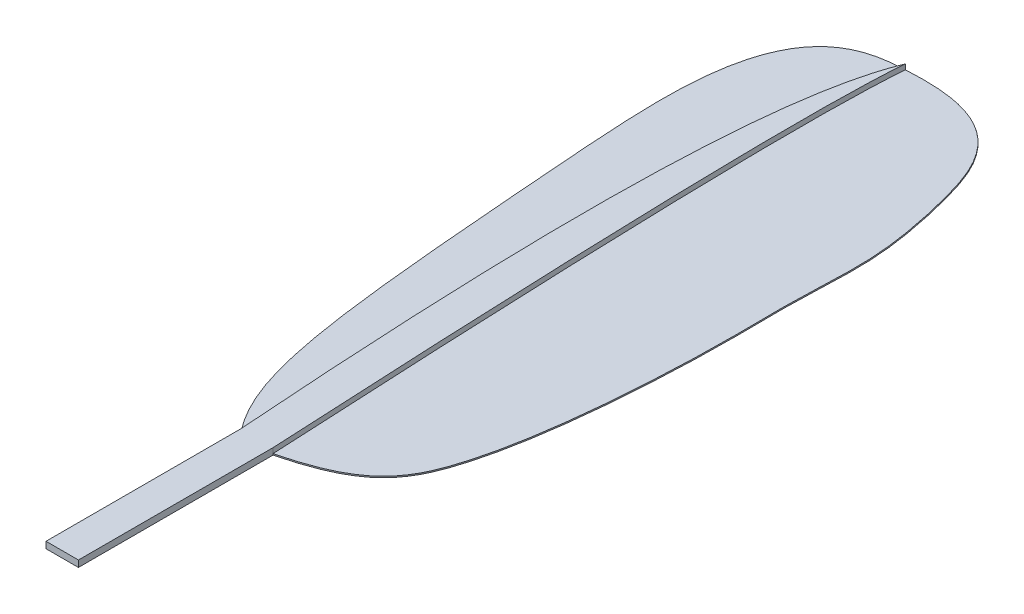
ISO-10303-21;
HEADER;
FILE_DESCRIPTION(('STEP AP214'),'2;1');
FILE_NAME('part.step','',(''),(''),'','','');
FILE_SCHEMA(('AUTOMOTIVE_DESIGN { 1 0 10303 214 1 1 1 1 }'));
ENDSEC;
DATA;
#1=APPLICATION_CONTEXT('core data for automotive mechanical design processes');
#2=APPLICATION_PROTOCOL_DEFINITION('international standard','automotive_design',2000,#1);
#3=PRODUCT_CONTEXT('',#1,'mechanical');
#4=PRODUCT('Part','Part','',(#3));
#5=PRODUCT_RELATED_PRODUCT_CATEGORY('part','',(#4));
#6=PRODUCT_DEFINITION_FORMATION('','',#4);
#7=PRODUCT_DEFINITION_CONTEXT('part definition',#1,'design');
#8=PRODUCT_DEFINITION('design','',#6,#7);
#9=PRODUCT_DEFINITION_SHAPE('','',#8);
#10=(LENGTH_UNIT() NAMED_UNIT(*) SI_UNIT(.MILLI.,.METRE.));
#11=(NAMED_UNIT(*) PLANE_ANGLE_UNIT() SI_UNIT($,.RADIAN.));
#12=(NAMED_UNIT(*) SI_UNIT($,.STERADIAN.) SOLID_ANGLE_UNIT());
#13=UNCERTAINTY_MEASURE_WITH_UNIT(LENGTH_MEASURE(1.E-05),#10,'distance_accuracy_value','');
#14=(GEOMETRIC_REPRESENTATION_CONTEXT(3) GLOBAL_UNCERTAINTY_ASSIGNED_CONTEXT((#13)) GLOBAL_UNIT_ASSIGNED_CONTEXT((#10,
#11,#12)) REPRESENTATION_CONTEXT('',''));
#15=CARTESIAN_POINT('',(0.,0.,0.));
#16=DIRECTION('',(0.,0.,1.));
#17=DIRECTION('',(1.,0.,0.));
#18=AXIS2_PLACEMENT_3D('',#15,#16,#17);
#19=CARTESIAN_POINT('',(-2.5,1.,0.));
#20=CARTESIAN_POINT('',(-8.33151031217227,1.,-79.885222780422));
#21=CARTESIAN_POINT('',(0.,1.,-100.));
#22=B_SPLINE_CURVE_WITH_KNOTS('',2,(#19,#20,#21),.UNSPECIFIED.,.F.,.F.,(3,3),(0.,1.),.UNSPECIFIED.);
#23=DIRECTION('',(0.,-1.,0.));
#24=VECTOR('',#23,1.);
#25=SURFACE_OF_LINEAR_EXTRUSION('',#22,#24);
#26=CARTESIAN_POINT('',(-2.5,0.2,0.));
#27=CARTESIAN_POINT('',(-8.33151031217227,0.2,-79.885222780422));
#28=CARTESIAN_POINT('',(0.,0.2,-100.));
#29=B_SPLINE_CURVE_WITH_KNOTS('',2,(#26,#27,#28),.UNSPECIFIED.,.F.,.F.,(3,3),(0.,1.),.UNSPECIFIED.);
#30=CARTESIAN_POINT('',(-2.5,0.2,0.));
#31=VERTEX_POINT('',#30);
#32=CARTESIAN_POINT('',(0.,0.2,-100.));
#33=VERTEX_POINT('',#32);
#34=EDGE_CURVE('E97',#31,#33,#29,.T.);
#35=ORIENTED_EDGE('',*,*,#34,.F.);
#36=DIRECTION('',(0.,-1.,0.));
#37=VECTOR('',#36,1.);
#38=CARTESIAN_POINT('',(-2.5,1.,0.));
#39=LINE('',#38,#37);
#40=CARTESIAN_POINT('',(-2.5,1.,0.));
#41=VERTEX_POINT('',#40);
#42=EDGE_CURVE('E12',#41,#31,#39,.T.);
#43=ORIENTED_EDGE('',*,*,#42,.F.);
#44=CARTESIAN_POINT('',(0.,1.,-100.));
#45=VERTEX_POINT('',#44);
#46=EDGE_CURVE('E263',#41,#45,#22,.T.);
#47=ORIENTED_EDGE('',*,*,#46,.T.);
#48=DIRECTION('',(0.,-1.,0.));
#49=VECTOR('',#48,1.);
#50=CARTESIAN_POINT('',(0.,1.,-100.));
#51=LINE('',#50,#49);
#52=EDGE_CURVE('E187',#45,#33,#51,.T.);
#53=ORIENTED_EDGE('',*,*,#52,.T.);
#54=EDGE_LOOP('',(#35,#43,#47,#53));
#55=FACE_BOUND('',#54,.T.);
#56=ADVANCED_FACE('F79',(#55),#25,.T.);
#57=CARTESIAN_POINT('',(-2.5,1.,0.));
#58=DIRECTION('',(1.,0.,0.));
#59=DIRECTION('',(0.,0.,-1.));
#60=AXIS2_PLACEMENT_3D('',#57,#58,#59);
#61=PLANE('',#60);
#62=DIRECTION('',(0.,0.,1.));
#63=VECTOR('',#62,1.);
#64=CARTESIAN_POINT('',(-2.5,0.,0.));
#65=LINE('',#64,#63);
#66=CARTESIAN_POINT('',(-2.5,0.,0.));
#67=VERTEX_POINT('',#66);
#68=CARTESIAN_POINT('',(-2.5,0.,30.));
#69=VERTEX_POINT('',#68);
#70=EDGE_CURVE('E156',#67,#69,#65,.T.);
#71=ORIENTED_EDGE('',*,*,#70,.T.);
#72=DIRECTION('',(0.,-1.,0.));
#73=VECTOR('',#72,1.);
#74=CARTESIAN_POINT('',(-2.5,1.,30.));
#75=LINE('',#74,#73);
#76=CARTESIAN_POINT('',(-2.5,1.,30.));
#77=VERTEX_POINT('',#76);
#78=EDGE_CURVE('E89',#77,#69,#75,.T.);
#79=ORIENTED_EDGE('',*,*,#78,.F.);
#80=DIRECTION('',(0.,0.,1.));
#81=VECTOR('',#80,1.);
#82=CARTESIAN_POINT('',(-2.5,1.,0.));
#83=LINE('',#82,#81);
#84=EDGE_CURVE('E266',#41,#77,#83,.T.);
#85=ORIENTED_EDGE('',*,*,#84,.F.);
#86=ORIENTED_EDGE('',*,*,#42,.T.);
#87=DIRECTION('',(0.,-1.,0.));
#88=VECTOR('',#87,1.);
#89=CARTESIAN_POINT('',(-2.5,0.2,0.));
#90=LINE('',#89,#88);
#91=EDGE_CURVE('E160',#31,#67,#90,.T.);
#92=ORIENTED_EDGE('',*,*,#91,.T.);
#93=EDGE_LOOP('',(#71,#79,#85,#86,#92));
#94=FACE_BOUND('',#93,.T.);
#95=ADVANCED_FACE('F281',(#94),#61,.F.);
#96=CARTESIAN_POINT('',(0.,1.,30.));
#97=DIRECTION('',(0.,0.,-1.));
#98=DIRECTION('',(-1.,0.,0.));
#99=AXIS2_PLACEMENT_3D('',#96,#97,#98);
#100=PLANE('',#99);
#101=DIRECTION('',(1.,0.,0.));
#102=VECTOR('',#101,1.);
#103=CARTESIAN_POINT('',(0.,0.,30.));
#104=LINE('',#103,#102);
#105=CARTESIAN_POINT('',(2.5,0.,30.));
#106=VERTEX_POINT('',#105);
#107=EDGE_CURVE('E259',#69,#106,#104,.T.);
#108=ORIENTED_EDGE('',*,*,#107,.T.);
#109=DIRECTION('',(0.,-1.,0.));
#110=VECTOR('',#109,1.);
#111=CARTESIAN_POINT('',(2.5,1.,30.));
#112=LINE('',#111,#110);
#113=CARTESIAN_POINT('',(2.5,1.,30.));
#114=VERTEX_POINT('',#113);
#115=EDGE_CURVE('E199',#114,#106,#112,.T.);
#116=ORIENTED_EDGE('',*,*,#115,.F.);
#117=DIRECTION('',(1.,0.,0.));
#118=VECTOR('',#117,1.);
#119=CARTESIAN_POINT('',(0.,1.,30.));
#120=LINE('',#119,#118);
#121=EDGE_CURVE('E269',#77,#114,#120,.T.);
#122=ORIENTED_EDGE('',*,*,#121,.F.);
#123=ORIENTED_EDGE('',*,*,#78,.T.);
#124=EDGE_LOOP('',(#108,#116,#122,#123));
#125=FACE_BOUND('',#124,.T.);
#126=ADVANCED_FACE('F285',(#125),#100,.F.);
#127=CARTESIAN_POINT('',(2.5,1.,0.));
#128=DIRECTION('',(1.,0.,0.));
#129=DIRECTION('',(0.,0.,-1.));
#130=AXIS2_PLACEMENT_3D('',#127,#128,#129);
#131=PLANE('',#130);
#132=DIRECTION('',(0.,0.,1.));
#133=VECTOR('',#132,1.);
#134=CARTESIAN_POINT('',(2.5,0.,0.));
#135=LINE('',#134,#133);
#136=CARTESIAN_POINT('',(2.5,0.,0.));
#137=VERTEX_POINT('',#136);
#138=EDGE_CURVE('E196',#137,#106,#135,.T.);
#139=ORIENTED_EDGE('',*,*,#138,.F.);
#140=DIRECTION('',(0.,-1.,0.));
#141=VECTOR('',#140,1.);
#142=CARTESIAN_POINT('',(2.5,0.2,0.));
#143=LINE('',#142,#141);
#144=CARTESIAN_POINT('',(2.5,0.2,0.));
#145=VERTEX_POINT('',#144);
#146=EDGE_CURVE('E104',#145,#137,#143,.T.);
#147=ORIENTED_EDGE('',*,*,#146,.F.);
#148=DIRECTION('',(0.,-1.,0.));
#149=VECTOR('',#148,1.);
#150=CARTESIAN_POINT('',(2.5,1.,0.));
#151=LINE('',#150,#149);
#152=CARTESIAN_POINT('',(2.5,1.,0.));
#153=VERTEX_POINT('',#152);
#154=EDGE_CURVE('E191',#153,#145,#151,.T.);
#155=ORIENTED_EDGE('',*,*,#154,.F.);
#156=DIRECTION('',(0.,0.,1.));
#157=VECTOR('',#156,1.);
#158=CARTESIAN_POINT('',(2.5,1.,0.));
#159=LINE('',#158,#157);
#160=EDGE_CURVE('E253',#153,#114,#159,.T.);
#161=ORIENTED_EDGE('',*,*,#160,.T.);
#162=ORIENTED_EDGE('',*,*,#115,.T.);
#163=EDGE_LOOP('',(#139,#147,#155,#161,#162));
#164=FACE_BOUND('',#163,.T.);
#165=ADVANCED_FACE('F245',(#164),#131,.T.);
#166=CARTESIAN_POINT('',(2.5,1.,0.));
#167=CARTESIAN_POINT('',(-1.63918434809833,1.,-79.8301801534041));
#168=CARTESIAN_POINT('',(0.,1.,-100.));
#169=B_SPLINE_CURVE_WITH_KNOTS('',2,(#166,#167,#168),.UNSPECIFIED.,.F.,.F.,(3,3),(0.,1.),.UNSPECIFIED.);
#170=DIRECTION('',(0.,-1.,0.));
#171=VECTOR('',#170,1.);
#172=SURFACE_OF_LINEAR_EXTRUSION('',#169,#171);
#173=ORIENTED_EDGE('',*,*,#154,.T.);
#174=CARTESIAN_POINT('',(2.5,0.2,0.));
#175=CARTESIAN_POINT('',(-1.63918434809833,0.2,-79.8301801534041));
#176=CARTESIAN_POINT('',(0.,0.2,-100.));
#177=B_SPLINE_CURVE_WITH_KNOTS('',2,(#174,#175,#176),.UNSPECIFIED.,.F.,.F.,(3,3),(0.,1.),.UNSPECIFIED.);
#178=EDGE_CURVE('E148',#145,#33,#177,.T.);
#179=ORIENTED_EDGE('',*,*,#178,.T.);
#180=ORIENTED_EDGE('',*,*,#52,.F.);
#181=EDGE_CURVE('E192',#153,#45,#169,.T.);
#182=ORIENTED_EDGE('',*,*,#181,.F.);
#183=EDGE_LOOP('',(#173,#179,#180,#182));
#184=FACE_BOUND('',#183,.T.);
#185=ADVANCED_FACE('F209',(#184),#172,.F.);
#186=CARTESIAN_POINT('',(0.,1.,0.));
#187=DIRECTION('',(0.,1.,0.));
#188=DIRECTION('',(0.,0.,1.));
#189=AXIS2_PLACEMENT_3D('',#186,#187,#188);
#190=PLANE('',#189);
#191=ORIENTED_EDGE('',*,*,#46,.F.);
#192=ORIENTED_EDGE('',*,*,#84,.T.);
#193=ORIENTED_EDGE('',*,*,#121,.T.);
#194=ORIENTED_EDGE('',*,*,#160,.F.);
#195=ORIENTED_EDGE('',*,*,#181,.T.);
#196=EDGE_LOOP('',(#191,#192,#193,#194,#195));
#197=FACE_BOUND('',#196,.T.);
#198=ADVANCED_FACE('F236',(#197),#190,.T.);
#199=CARTESIAN_POINT('',(0.,0.,0.));
#200=DIRECTION('',(0.,1.,0.));
#201=DIRECTION('',(0.,0.,1.));
#202=AXIS2_PLACEMENT_3D('',#199,#200,#201);
#203=PLANE('',#202);
#204=ORIENTED_EDGE('',*,*,#70,.F.);
#205=CARTESIAN_POINT('',(0.,0.,-100.));
#206=CARTESIAN_POINT('',(-7.35753604473764,0.,-99.756200735484));
#207=CARTESIAN_POINT('',(-16.6393614546275,0.,-96.1727396098631));
#208=CARTESIAN_POINT('',(-11.3376545029552,0.,-24.2277312876407));
#209=CARTESIAN_POINT('',(-9.55772822347636,0.,-8.38325722956601));
#210=CARTESIAN_POINT('',(-2.49999999999996,0.,0.));
#211=B_SPLINE_CURVE_WITH_KNOTS('',3,(#205,#206,#207,#208,#209,#210),.UNSPECIFIED.,.F.,.F.,(4,1,
1,4),(0.,0.313531983306057,0.413531983306057,1.),.UNSPECIFIED.);
#212=CARTESIAN_POINT('',(0.,0.,-100.));
#213=VERTEX_POINT('',#212);
#214=EDGE_CURVE('E153',#213,#67,#211,.T.);
#215=ORIENTED_EDGE('',*,*,#214,.F.);
#216=CARTESIAN_POINT('',(2.5,0.,0.));
#217=CARTESIAN_POINT('',(12.9342013073396,0.,-2.63107768561277));
#218=CARTESIAN_POINT('',(20.6224835825794,0.,-11.7076151659828));
#219=CARTESIAN_POINT('',(22.5547360806352,0.,-44.5430397404868));
#220=CARTESIAN_POINT('',(22.0049059992091,0.,-67.1717850112475));
#221=CARTESIAN_POINT('',(23.8109051463702,0.,-72.5917666718817));
#222=CARTESIAN_POINT('',(16.9191397590032,0.,-98.0712072019772));
#223=CARTESIAN_POINT('',(8.94241288910098,0.,-100.567138422392));
#224=CARTESIAN_POINT('',(0.,0.,-100.));
#225=B_SPLINE_CURVE_WITH_KNOTS('',3,(#216,#217,#218,#219,#220,#221,#222,#223,#224),
.UNSPECIFIED.,.F.,.F.,(4,1,1,1,1,1,4),(0.,0.156099619785498,0.394681350415879,0.460940872053778,
0.75243531452659,0.809984907852122,1.),.UNSPECIFIED.);
#226=EDGE_CURVE('E138',#137,#213,#225,.T.);
#227=ORIENTED_EDGE('',*,*,#226,.F.);
#228=ORIENTED_EDGE('',*,*,#138,.T.);
#229=ORIENTED_EDGE('',*,*,#107,.F.);
#230=EDGE_LOOP('',(#204,#215,#227,#228,#229));
#231=FACE_BOUND('',#230,.T.);
#232=ADVANCED_FACE('F154',(#231),#203,.F.);
#233=CARTESIAN_POINT('',(2.5,0.2,0.));
#234=CARTESIAN_POINT('',(12.9342013073396,0.2,-2.63107768561277));
#235=CARTESIAN_POINT('',(20.6224835825794,0.2,-11.7076151659828));
#236=CARTESIAN_POINT('',(22.5547360806352,0.2,-44.5430397404868));
#237=CARTESIAN_POINT('',(22.0049059992091,0.2,-67.1717850112475));
#238=CARTESIAN_POINT('',(23.8109051463702,0.2,-72.5917666718817));
#239=CARTESIAN_POINT('',(16.9191397590032,0.2,-98.0712072019772));
#240=CARTESIAN_POINT('',(8.94241288910098,0.2,-100.567138422392));
#241=CARTESIAN_POINT('',(0.,0.2,-100.));
#242=B_SPLINE_CURVE_WITH_KNOTS('',3,(#233,#234,#235,#236,#237,#238,#239,#240,#241),
.UNSPECIFIED.,.F.,.F.,(4,1,1,1,1,1,4),(0.,0.156099619785498,0.394681350415879,0.460940872053778,
0.75243531452659,0.809984907852122,1.),.UNSPECIFIED.);
#243=DIRECTION('',(0.,-1.,0.));
#244=VECTOR('',#243,1.);
#245=SURFACE_OF_LINEAR_EXTRUSION('',#242,#244);
#246=ORIENTED_EDGE('',*,*,#226,.T.);
#247=DIRECTION('',(0.,-1.,0.));
#248=VECTOR('',#247,1.);
#249=CARTESIAN_POINT('',(0.,0.2,-100.));
#250=LINE('',#249,#248);
#251=EDGE_CURVE('E143',#33,#213,#250,.T.);
#252=ORIENTED_EDGE('',*,*,#251,.F.);
#253=EDGE_CURVE('E165',#145,#33,#242,.T.);
#254=ORIENTED_EDGE('',*,*,#253,.F.);
#255=ORIENTED_EDGE('',*,*,#146,.T.);
#256=EDGE_LOOP('',(#246,#252,#254,#255));
#257=FACE_BOUND('',#256,.T.);
#258=ADVANCED_FACE('F140',(#257),#245,.F.);
#259=CARTESIAN_POINT('',(0.,0.2,0.));
#260=DIRECTION('',(0.,1.,0.));
#261=DIRECTION('',(0.,0.,1.));
#262=AXIS2_PLACEMENT_3D('',#259,#260,#261);
#263=PLANE('',#262);
#264=ORIENTED_EDGE('',*,*,#178,.F.);
#265=ORIENTED_EDGE('',*,*,#253,.T.);
#266=EDGE_LOOP('',(#264,#265));
#267=FACE_BOUND('',#266,.T.);
#268=ADVANCED_FACE('F214',(#267),#263,.T.);
#269=CARTESIAN_POINT('',(0.,0.2,-100.));
#270=CARTESIAN_POINT('',(-7.35753604473764,0.2,-99.756200735484));
#271=CARTESIAN_POINT('',(-16.6393614546275,0.2,-96.1727396098631));
#272=CARTESIAN_POINT('',(-11.3376545029552,0.2,-24.2277312876407));
#273=CARTESIAN_POINT('',(-9.55772822347636,0.2,-8.38325722956601));
#274=CARTESIAN_POINT('',(-2.49999999999996,0.2,0.));
#275=B_SPLINE_CURVE_WITH_KNOTS('',3,(#269,#270,#271,#272,#273,#274),.UNSPECIFIED.,.F.,.F.,(4,1,
1,4),(0.,0.313531983306057,0.413531983306057,1.),.UNSPECIFIED.);
#276=DIRECTION('',(0.,-1.,0.));
#277=VECTOR('',#276,1.);
#278=SURFACE_OF_LINEAR_EXTRUSION('',#275,#277);
#279=ORIENTED_EDGE('',*,*,#214,.T.);
#280=ORIENTED_EDGE('',*,*,#91,.F.);
#281=EDGE_CURVE('E149',#33,#31,#275,.T.);
#282=ORIENTED_EDGE('',*,*,#281,.F.);
#283=ORIENTED_EDGE('',*,*,#251,.T.);
#284=EDGE_LOOP('',(#279,#280,#282,#283));
#285=FACE_BOUND('',#284,.T.);
#286=ADVANCED_FACE('F162',(#285),#278,.F.);
#287=CARTESIAN_POINT('',(0.,0.2,0.));
#288=DIRECTION('',(0.,1.,0.));
#289=DIRECTION('',(0.,0.,1.));
#290=AXIS2_PLACEMENT_3D('',#287,#288,#289);
#291=PLANE('',#290);
#292=ORIENTED_EDGE('',*,*,#34,.T.);
#293=ORIENTED_EDGE('',*,*,#281,.T.);
#294=EDGE_LOOP('',(#292,#293));
#295=FACE_BOUND('',#294,.T.);
#296=ADVANCED_FACE('F304',(#295),#291,.T.);
#297=CLOSED_SHELL('',(#56,#95,#126,#165,#185,#198,#232,#258,#268,#286,#296));
#298=MANIFOLD_SOLID_BREP('B2',#297);
#299=ADVANCED_BREP_SHAPE_REPRESENTATION('',(#18,#298),#14);
#300=SHAPE_DEFINITION_REPRESENTATION(#9,#299);
ENDSEC;
END-ISO-10303-21;
